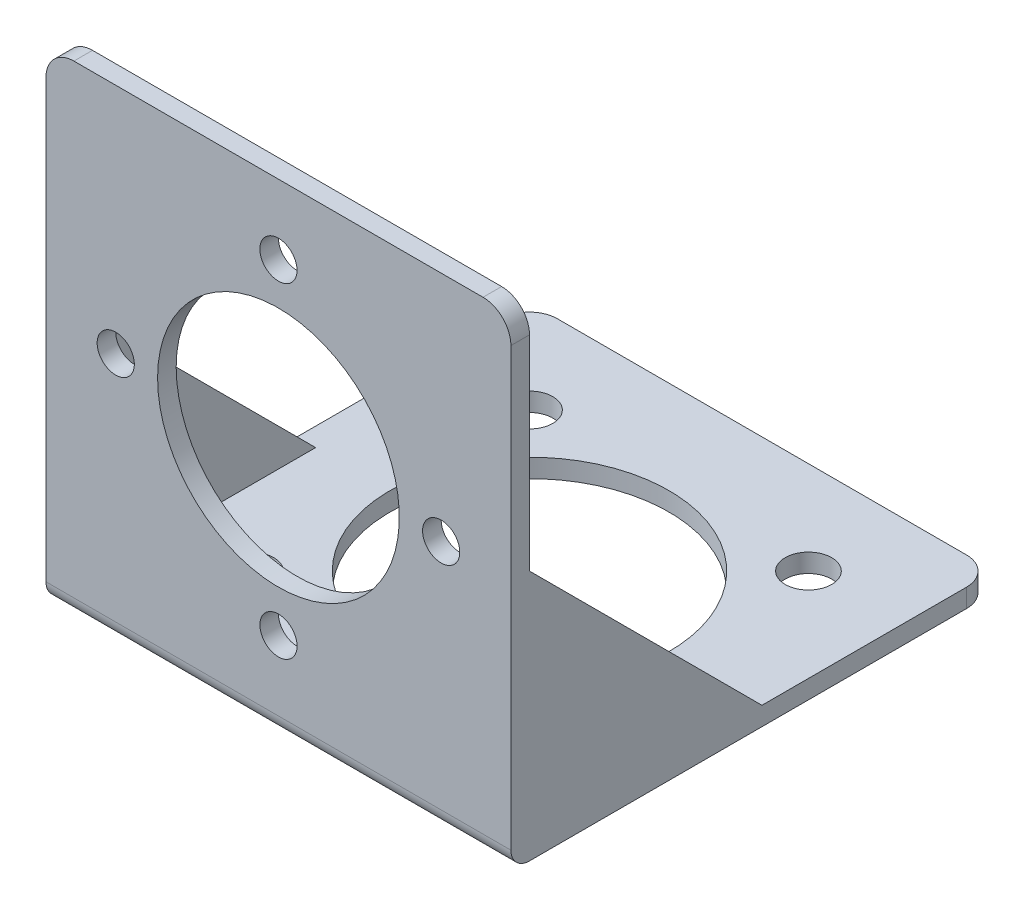
ISO-10303-21;
HEADER;
FILE_DESCRIPTION(('STEP AP214'),'2;1');
FILE_NAME('part.step','',(''),(''),'','','');
FILE_SCHEMA(('AUTOMOTIVE_DESIGN { 1 0 10303 214 1 1 1 1 }'));
ENDSEC;
DATA;
#1=APPLICATION_CONTEXT('core data for automotive mechanical design processes');
#2=APPLICATION_PROTOCOL_DEFINITION('international standard','automotive_design',2000,#1);
#3=PRODUCT_CONTEXT('',#1,'mechanical');
#4=PRODUCT('Part','Part','',(#3));
#5=PRODUCT_RELATED_PRODUCT_CATEGORY('part','',(#4));
#6=PRODUCT_DEFINITION_FORMATION('','',#4);
#7=PRODUCT_DEFINITION_CONTEXT('part definition',#1,'design');
#8=PRODUCT_DEFINITION('design','',#6,#7);
#9=PRODUCT_DEFINITION_SHAPE('','',#8);
#10=(LENGTH_UNIT() NAMED_UNIT(*) SI_UNIT(.MILLI.,.METRE.));
#11=(NAMED_UNIT(*) PLANE_ANGLE_UNIT() SI_UNIT($,.RADIAN.));
#12=(NAMED_UNIT(*) SI_UNIT($,.STERADIAN.) SOLID_ANGLE_UNIT());
#13=UNCERTAINTY_MEASURE_WITH_UNIT(LENGTH_MEASURE(1.E-05),#10,'distance_accuracy_value','');
#14=(GEOMETRIC_REPRESENTATION_CONTEXT(3) GLOBAL_UNCERTAINTY_ASSIGNED_CONTEXT((#13)) GLOBAL_UNIT_ASSIGNED_CONTEXT((#10,
#11,#12)) REPRESENTATION_CONTEXT('',''));
#15=CARTESIAN_POINT('',(0.,0.,0.));
#16=DIRECTION('',(0.,0.,1.));
#17=DIRECTION('',(1.,0.,0.));
#18=AXIS2_PLACEMENT_3D('',#15,#16,#17);
#19=CARTESIAN_POINT('',(96.1386740943104,26.9999999999998,-84.3339885545928));
#20=DIRECTION('',(0.,0.70710678118655,-0.707106781186545));
#21=DIRECTION('',(0.,0.707106781186545,0.70710678118655));
#22=AXIS2_PLACEMENT_3D('',#19,#20,#21);
#23=PLANE('',#22);
#24=DIRECTION('',(-1.,0.,0.));
#25=VECTOR('',#24,1.);
#26=CARTESIAN_POINT('',(96.1386740943104,2.,-109.333988554593));
#27=LINE('',#26,#25);
#28=CARTESIAN_POINT('',(96.1386740943104,2.,-109.333988554593));
#29=VERTEX_POINT('',#28);
#30=CARTESIAN_POINT('',(94.1386740943104,2.,-109.333988554593));
#31=VERTEX_POINT('',#30);
#32=EDGE_CURVE('E186',#29,#31,#27,.T.);
#33=ORIENTED_EDGE('',*,*,#32,.T.);
#34=DIRECTION('',(0.,-0.707106781186548,-0.707106781186547));
#35=VECTOR('',#34,1.);
#36=CARTESIAN_POINT('',(94.1386740943104,27.,-84.3339885545928));
#37=LINE('',#36,#35);
#38=CARTESIAN_POINT('',(94.1386740943104,27.,-84.3339885545928));
#39=VERTEX_POINT('',#38);
#40=EDGE_CURVE('E235',#39,#31,#37,.T.);
#41=ORIENTED_EDGE('',*,*,#40,.F.);
#42=DIRECTION('',(-1.,0.,0.));
#43=VECTOR('',#42,1.);
#44=CARTESIAN_POINT('',(96.1386740943104,26.9999999999998,-84.3339885545928));
#45=LINE('',#44,#43);
#46=CARTESIAN_POINT('',(96.1386740943104,26.9999999999998,-84.3339885545928));
#47=VERTEX_POINT('',#46);
#48=EDGE_CURVE('E171',#47,#39,#45,.T.);
#49=ORIENTED_EDGE('',*,*,#48,.F.);
#50=DIRECTION('',(0.,-0.707106781186545,-0.70710678118655));
#51=VECTOR('',#50,1.);
#52=CARTESIAN_POINT('',(96.1386740943104,26.9999999999998,-84.3339885545928));
#53=LINE('',#52,#51);
#54=EDGE_CURVE('E164',#47,#29,#53,.T.);
#55=ORIENTED_EDGE('',*,*,#54,.T.);
#56=EDGE_LOOP('',(#33,#41,#49,#55));
#57=FACE_BOUND('',#56,.T.);
#58=ADVANCED_FACE('F35',(#57),#23,.T.);
#59=DIRECTION('',(0.,-0.707106781186548,-0.707106781186547));
#60=VECTOR('',#59,1.);
#61=CARTESIAN_POINT('',(48.1386740943102,27.,-84.3339885545928));
#62=LINE('',#61,#60);
#63=CARTESIAN_POINT('',(48.1386740943102,27.,-84.3339885545928));
#64=VERTEX_POINT('',#63);
#65=CARTESIAN_POINT('',(48.1386740943102,2.,-109.333988554593));
#66=VERTEX_POINT('',#65);
#67=EDGE_CURVE('E233',#64,#66,#62,.T.);
#68=ORIENTED_EDGE('',*,*,#67,.T.);
#69=CARTESIAN_POINT('',(46.1386740943102,2.,-109.333988554593));
#70=VERTEX_POINT('',#69);
#71=EDGE_CURVE('E162',#66,#70,#27,.T.);
#72=ORIENTED_EDGE('',*,*,#71,.T.);
#73=DIRECTION('',(0.,-0.707106781186545,-0.70710678118655));
#74=VECTOR('',#73,1.);
#75=CARTESIAN_POINT('',(46.1386740943102,26.9999999999998,-84.3339885545928));
#76=LINE('',#75,#74);
#77=CARTESIAN_POINT('',(46.1386740943102,26.9999999999999,-84.3339885545928));
#78=VERTEX_POINT('',#77);
#79=EDGE_CURVE('E148',#78,#70,#76,.T.);
#80=ORIENTED_EDGE('',*,*,#79,.F.);
#81=EDGE_CURVE('E159',#64,#78,#45,.T.);
#82=ORIENTED_EDGE('',*,*,#81,.F.);
#83=EDGE_LOOP('',(#68,#72,#80,#82));
#84=FACE_BOUND('',#83,.T.);
#85=ADVANCED_FACE('F158',(#84),#23,.T.);
#86=CARTESIAN_POINT('',(96.1386740943104,0.,0.));
#87=DIRECTION('',(1.,0.,0.));
#88=DIRECTION('',(0.,0.,-1.));
#89=AXIS2_PLACEMENT_3D('',#86,#87,#88);
#90=PLANE('',#89);
#91=DIRECTION('',(0.,1.,0.));
#92=VECTOR('',#91,1.);
#93=CARTESIAN_POINT('',(96.1386740943104,52.,-84.3339885545928));
#94=LINE('',#93,#92);
#95=CARTESIAN_POINT('',(96.1386740943104,49.0000000000002,-84.3339885545928));
#96=VERTEX_POINT('',#95);
#97=EDGE_CURVE('E152',#47,#96,#94,.T.);
#98=ORIENTED_EDGE('',*,*,#97,.T.);
#99=DIRECTION('',(0.,0.,-1.));
#100=VECTOR('',#99,1.);
#101=CARTESIAN_POINT('',(96.1386740943104,49.0000000000002,-82.3339885545928));
#102=LINE('',#101,#100);
#103=CARTESIAN_POINT('',(96.1386740943104,49.0000000000002,-82.3339885545928));
#104=VERTEX_POINT('',#103);
#105=EDGE_CURVE('E262',#96,#104,#102,.F.);
#106=ORIENTED_EDGE('',*,*,#105,.T.);
#107=DIRECTION('',(0.,1.,0.));
#108=VECTOR('',#107,1.);
#109=CARTESIAN_POINT('',(96.1386740943104,52.,-82.3339885545928));
#110=LINE('',#109,#108);
#111=CARTESIAN_POINT('',(96.1386740943104,2.00000000000002,-82.3339885545928));
#112=VERTEX_POINT('',#111);
#113=EDGE_CURVE('E319',#112,#104,#110,.T.);
#114=ORIENTED_EDGE('',*,*,#113,.F.);
#115=CARTESIAN_POINT('',(96.1386740943104,2.,-84.3339885545928));
#116=DIRECTION('',(1.,0.,0.));
#117=DIRECTION('',(0.,0.,-1.));
#118=AXIS2_PLACEMENT_3D('',#115,#116,#117);
#119=CIRCLE('',#118,2.);
#120=CARTESIAN_POINT('',(96.1386740943104,0.,-84.3339885545928));
#121=VERTEX_POINT('',#120);
#122=EDGE_CURVE('E197',#112,#121,#119,.T.);
#123=ORIENTED_EDGE('',*,*,#122,.T.);
#124=DIRECTION('',(0.,0.,1.));
#125=VECTOR('',#124,1.);
#126=CARTESIAN_POINT('',(96.1386740943104,0.,-84.3339885545928));
#127=LINE('',#126,#125);
#128=CARTESIAN_POINT('',(96.1386740943104,0.,-131.333988554593));
#129=VERTEX_POINT('',#128);
#130=EDGE_CURVE('E165',#129,#121,#127,.T.);
#131=ORIENTED_EDGE('',*,*,#130,.F.);
#132=DIRECTION('',(0.,1.,0.));
#133=VECTOR('',#132,1.);
#134=CARTESIAN_POINT('',(96.1386740943104,2.,-131.333988554593));
#135=LINE('',#134,#133);
#136=CARTESIAN_POINT('',(96.1386740943104,2.,-131.333988554593));
#137=VERTEX_POINT('',#136);
#138=EDGE_CURVE('E259',#129,#137,#135,.T.);
#139=ORIENTED_EDGE('',*,*,#138,.T.);
#140=DIRECTION('',(0.,0.,1.));
#141=VECTOR('',#140,1.);
#142=CARTESIAN_POINT('',(96.1386740943104,2.,-84.3339885545928));
#143=LINE('',#142,#141);
#144=EDGE_CURVE('E248',#137,#29,#143,.T.);
#145=ORIENTED_EDGE('',*,*,#144,.T.);
#146=ORIENTED_EDGE('',*,*,#54,.F.);
#147=EDGE_LOOP('',(#98,#106,#114,#123,#131,#139,#145,#146));
#148=FACE_BOUND('',#147,.T.);
#149=ADVANCED_FACE('F286',(#148),#90,.T.);
#150=CARTESIAN_POINT('',(46.1386740943102,0.,0.));
#151=DIRECTION('',(1.,0.,0.));
#152=DIRECTION('',(0.,0.,-1.));
#153=AXIS2_PLACEMENT_3D('',#150,#151,#152);
#154=PLANE('',#153);
#155=DIRECTION('',(0.,-1.,0.));
#156=VECTOR('',#155,1.);
#157=CARTESIAN_POINT('',(46.1386740943102,0.,-82.3339885545928));
#158=LINE('',#157,#156);
#159=CARTESIAN_POINT('',(46.1386740943102,49.0000000000001,-82.3339885545928));
#160=VERTEX_POINT('',#159);
#161=CARTESIAN_POINT('',(46.1386740943102,2.,-82.3339885545928));
#162=VERTEX_POINT('',#161);
#163=EDGE_CURVE('E314',#160,#162,#158,.T.);
#164=ORIENTED_EDGE('',*,*,#163,.F.);
#165=DIRECTION('',(0.,0.,-1.));
#166=VECTOR('',#165,1.);
#167=CARTESIAN_POINT('',(46.1386740943102,49.0000000000002,0.));
#168=LINE('',#167,#166);
#169=CARTESIAN_POINT('',(46.1386740943102,49.0000000000001,-84.3339885545928));
#170=VERTEX_POINT('',#169);
#171=EDGE_CURVE('E11',#160,#170,#168,.T.);
#172=ORIENTED_EDGE('',*,*,#171,.T.);
#173=DIRECTION('',(0.,-1.,0.));
#174=VECTOR('',#173,1.);
#175=CARTESIAN_POINT('',(46.1386740943102,0.,-84.3339885545928));
#176=LINE('',#175,#174);
#177=EDGE_CURVE('E144',#170,#78,#176,.T.);
#178=ORIENTED_EDGE('',*,*,#177,.T.);
#179=ORIENTED_EDGE('',*,*,#79,.T.);
#180=DIRECTION('',(0.,0.,-1.));
#181=VECTOR('',#180,1.);
#182=CARTESIAN_POINT('',(46.1386740943102,2.,-134.333988554593));
#183=LINE('',#182,#181);
#184=CARTESIAN_POINT('',(46.1386740943102,2.,-131.333988554593));
#185=VERTEX_POINT('',#184);
#186=EDGE_CURVE('E244',#70,#185,#183,.T.);
#187=ORIENTED_EDGE('',*,*,#186,.T.);
#188=DIRECTION('',(0.,1.,0.));
#189=VECTOR('',#188,1.);
#190=CARTESIAN_POINT('',(46.1386740943102,0.,-131.333988554593));
#191=LINE('',#190,#189);
#192=CARTESIAN_POINT('',(46.1386740943102,0.,-131.333988554593));
#193=VERTEX_POINT('',#192);
#194=EDGE_CURVE('E43',#185,#193,#191,.F.);
#195=ORIENTED_EDGE('',*,*,#194,.T.);
#196=DIRECTION('',(0.,0.,-1.));
#197=VECTOR('',#196,1.);
#198=CARTESIAN_POINT('',(46.1386740943102,0.,-134.333988554593));
#199=LINE('',#198,#197);
#200=CARTESIAN_POINT('',(46.1386740943102,0.,-84.3339885545928));
#201=VERTEX_POINT('',#200);
#202=EDGE_CURVE('E245',#201,#193,#199,.T.);
#203=ORIENTED_EDGE('',*,*,#202,.F.);
#204=CARTESIAN_POINT('',(46.1386740943102,2.,-84.3339885545928));
#205=DIRECTION('',(1.,0.,0.));
#206=DIRECTION('',(0.,0.,-1.));
#207=AXIS2_PLACEMENT_3D('',#204,#205,#206);
#208=CIRCLE('',#207,2.);
#209=EDGE_CURVE('E207',#201,#162,#208,.F.);
#210=ORIENTED_EDGE('',*,*,#209,.T.);
#211=EDGE_LOOP('',(#164,#172,#178,#179,#187,#195,#203,#210));
#212=FACE_BOUND('',#211,.T.);
#213=ADVANCED_FACE('F147',(#212),#154,.F.);
#214=CARTESIAN_POINT('',(0.,2.,0.));
#215=DIRECTION('',(0.,1.,0.));
#216=DIRECTION('',(0.,0.,1.));
#217=AXIS2_PLACEMENT_3D('',#214,#215,#216);
#218=PLANE('',#217);
#219=CARTESIAN_POINT('',(56.1386740943103,2.,-94.3339885545928));
#220=DIRECTION('',(0.,1.,0.));
#221=DIRECTION('',(0.,0.,1.));
#222=AXIS2_PLACEMENT_3D('',#219,#220,#221);
#223=CIRCLE('',#222,2.49999999999993);
#224=CARTESIAN_POINT('',(56.1386740943103,2.,-91.8339885545929));
#225=VERTEX_POINT('',#224);
#226=EDGE_CURVE('E360',#225,#225,#223,.T.);
#227=ORIENTED_EDGE('',*,*,#226,.F.);
#228=EDGE_LOOP('',(#227));
#229=FACE_BOUND('',#228,.T.);
#230=CARTESIAN_POINT('',(86.1386740943104,2.,-94.333988554593));
#231=DIRECTION('',(0.,1.,0.));
#232=DIRECTION('',(0.,0.,1.));
#233=AXIS2_PLACEMENT_3D('',#230,#231,#232);
#234=CIRCLE('',#233,2.49999999999993);
#235=CARTESIAN_POINT('',(86.1386740943104,2.,-91.833988554593));
#236=VERTEX_POINT('',#235);
#237=EDGE_CURVE('E354',#236,#236,#234,.T.);
#238=ORIENTED_EDGE('',*,*,#237,.F.);
#239=EDGE_LOOP('',(#238));
#240=FACE_BOUND('',#239,.T.);
#241=CARTESIAN_POINT('',(86.1386740943102,2.,-124.333988554593));
#242=DIRECTION('',(0.,1.,0.));
#243=DIRECTION('',(0.,0.,1.));
#244=AXIS2_PLACEMENT_3D('',#241,#242,#243);
#245=CIRCLE('',#244,2.49999999999993);
#246=CARTESIAN_POINT('',(86.1386740943102,2.,-121.833988554593));
#247=VERTEX_POINT('',#246);
#248=EDGE_CURVE('E348',#247,#247,#245,.T.);
#249=ORIENTED_EDGE('',*,*,#248,.F.);
#250=EDGE_LOOP('',(#249));
#251=FACE_BOUND('',#250,.T.);
#252=CARTESIAN_POINT('',(56.1386740943102,2.,-124.333988554593));
#253=DIRECTION('',(0.,1.,0.));
#254=DIRECTION('',(0.,0.,1.));
#255=AXIS2_PLACEMENT_3D('',#252,#253,#254);
#256=CIRCLE('',#255,2.49999999999993);
#257=CARTESIAN_POINT('',(56.1386740943102,2.,-121.833988554593));
#258=VERTEX_POINT('',#257);
#259=EDGE_CURVE('E342',#258,#258,#256,.T.);
#260=ORIENTED_EDGE('',*,*,#259,.F.);
#261=EDGE_LOOP('',(#260));
#262=FACE_BOUND('',#261,.T.);
#263=CARTESIAN_POINT('',(71.1386740943103,2.,-109.333988554593));
#264=DIRECTION('',(0.,1.,0.));
#265=DIRECTION('',(0.,0.,1.));
#266=AXIS2_PLACEMENT_3D('',#263,#264,#265);
#267=CIRCLE('',#266,15.0000000000001);
#268=CARTESIAN_POINT('',(71.1386740943103,2.,-94.3339885545927));
#269=VERTEX_POINT('',#268);
#270=EDGE_CURVE('E336',#269,#269,#267,.T.);
#271=ORIENTED_EDGE('',*,*,#270,.F.);
#272=EDGE_LOOP('',(#271));
#273=FACE_BOUND('',#272,.T.);
#274=ORIENTED_EDGE('',*,*,#144,.F.);
#275=CARTESIAN_POINT('',(93.1386740943105,2.,-131.333988554593));
#276=DIRECTION('',(0.,1.,0.));
#277=DIRECTION('',(0.,0.,1.));
#278=AXIS2_PLACEMENT_3D('',#275,#276,#277);
#279=CIRCLE('',#278,2.99999999999989);
#280=CARTESIAN_POINT('',(93.1386740943105,2.,-134.333988554593));
#281=VERTEX_POINT('',#280);
#282=EDGE_CURVE('E270',#137,#281,#279,.T.);
#283=ORIENTED_EDGE('',*,*,#282,.T.);
#284=DIRECTION('',(1.,0.,0.));
#285=VECTOR('',#284,1.);
#286=CARTESIAN_POINT('',(96.1386740943104,2.,-134.333988554593));
#287=LINE('',#286,#285);
#288=CARTESIAN_POINT('',(49.1386740943101,2.,-134.333988554593));
#289=VERTEX_POINT('',#288);
#290=EDGE_CURVE('E253',#289,#281,#287,.T.);
#291=ORIENTED_EDGE('',*,*,#290,.F.);
#292=CARTESIAN_POINT('',(49.1386740943101,2.,-131.333988554593));
#293=DIRECTION('',(0.,1.,0.));
#294=DIRECTION('',(0.,0.,1.));
#295=AXIS2_PLACEMENT_3D('',#292,#293,#294);
#296=CIRCLE('',#295,2.99999999999989);
#297=EDGE_CURVE('E268',#289,#185,#296,.T.);
#298=ORIENTED_EDGE('',*,*,#297,.T.);
#299=ORIENTED_EDGE('',*,*,#186,.F.);
#300=ORIENTED_EDGE('',*,*,#71,.F.);
#301=DIRECTION('',(0.,0.,1.));
#302=VECTOR('',#301,1.);
#303=CARTESIAN_POINT('',(48.1386740943102,2.,-109.333988554593));
#304=LINE('',#303,#302);
#305=CARTESIAN_POINT('',(48.1386740943102,1.99999999999985,-84.3339885545928));
#306=VERTEX_POINT('',#305);
#307=EDGE_CURVE('E238',#66,#306,#304,.T.);
#308=ORIENTED_EDGE('',*,*,#307,.T.);
#309=DIRECTION('',(-1.,0.,0.));
#310=VECTOR('',#309,1.);
#311=CARTESIAN_POINT('',(94.1386740943104,1.99999999999985,-84.3339885545928));
#312=LINE('',#311,#310);
#313=CARTESIAN_POINT('',(94.1386740943104,1.99999999999985,-84.3339885545928));
#314=VERTEX_POINT('',#313);
#315=EDGE_CURVE('E237',#314,#306,#312,.T.);
#316=ORIENTED_EDGE('',*,*,#315,.F.);
#317=DIRECTION('',(0.,0.,1.));
#318=VECTOR('',#317,1.);
#319=CARTESIAN_POINT('',(94.1386740943104,2.,-109.333988554593));
#320=LINE('',#319,#318);
#321=EDGE_CURVE('E229',#31,#314,#320,.T.);
#322=ORIENTED_EDGE('',*,*,#321,.F.);
#323=ORIENTED_EDGE('',*,*,#32,.F.);
#324=EDGE_LOOP('',(#274,#283,#291,#298,#299,#300,#308,#316,#322,#323));
#325=FACE_BOUND('',#324,.T.);
#326=ADVANCED_FACE('F292',(#229,#240,#251,#262,#273,#325),#218,.T.);
#327=CARTESIAN_POINT('',(96.1386740943104,0.,-134.333988554593));
#328=DIRECTION('',(0.,0.,1.));
#329=DIRECTION('',(1.,0.,0.));
#330=AXIS2_PLACEMENT_3D('',#327,#328,#329);
#331=PLANE('',#330);
#332=ORIENTED_EDGE('',*,*,#290,.T.);
#333=DIRECTION('',(0.,1.,0.));
#334=VECTOR('',#333,1.);
#335=CARTESIAN_POINT('',(93.1386740943105,0.,-134.333988554593));
#336=LINE('',#335,#334);
#337=CARTESIAN_POINT('',(93.1386740943105,0.,-134.333988554593));
#338=VERTEX_POINT('',#337);
#339=EDGE_CURVE('E57',#281,#338,#336,.F.);
#340=ORIENTED_EDGE('',*,*,#339,.T.);
#341=DIRECTION('',(1.,0.,0.));
#342=VECTOR('',#341,1.);
#343=CARTESIAN_POINT('',(96.1386740943104,0.,-134.333988554593));
#344=LINE('',#343,#342);
#345=CARTESIAN_POINT('',(49.1386740943101,0.,-134.333988554593));
#346=VERTEX_POINT('',#345);
#347=EDGE_CURVE('E247',#346,#338,#344,.T.);
#348=ORIENTED_EDGE('',*,*,#347,.F.);
#349=DIRECTION('',(0.,1.,0.));
#350=VECTOR('',#349,1.);
#351=CARTESIAN_POINT('',(49.1386740943101,0.,-134.333988554593));
#352=LINE('',#351,#350);
#353=EDGE_CURVE('E272',#346,#289,#352,.T.);
#354=ORIENTED_EDGE('',*,*,#353,.T.);
#355=EDGE_LOOP('',(#332,#340,#348,#354));
#356=FACE_BOUND('',#355,.T.);
#357=ADVANCED_FACE('F293',(#356),#331,.F.);
#358=CARTESIAN_POINT('',(0.,0.,0.));
#359=DIRECTION('',(0.,1.,0.));
#360=DIRECTION('',(0.,0.,1.));
#361=AXIS2_PLACEMENT_3D('',#358,#359,#360);
#362=PLANE('',#361);
#363=CARTESIAN_POINT('',(56.1386740943103,0.,-94.3339885545928));
#364=DIRECTION('',(0.,1.,0.));
#365=DIRECTION('',(0.,0.,1.));
#366=AXIS2_PLACEMENT_3D('',#363,#364,#365);
#367=CIRCLE('',#366,2.49999999999993);
#368=CARTESIAN_POINT('',(56.1386740943103,0.,-91.8339885545929));
#369=VERTEX_POINT('',#368);
#370=EDGE_CURVE('E357',#369,#369,#367,.T.);
#371=ORIENTED_EDGE('',*,*,#370,.T.);
#372=EDGE_LOOP('',(#371));
#373=FACE_BOUND('',#372,.T.);
#374=CARTESIAN_POINT('',(86.1386740943104,0.,-94.333988554593));
#375=DIRECTION('',(0.,1.,0.));
#376=DIRECTION('',(0.,0.,1.));
#377=AXIS2_PLACEMENT_3D('',#374,#375,#376);
#378=CIRCLE('',#377,2.49999999999993);
#379=CARTESIAN_POINT('',(86.1386740943104,0.,-91.833988554593));
#380=VERTEX_POINT('',#379);
#381=EDGE_CURVE('E351',#380,#380,#378,.T.);
#382=ORIENTED_EDGE('',*,*,#381,.T.);
#383=EDGE_LOOP('',(#382));
#384=FACE_BOUND('',#383,.T.);
#385=CARTESIAN_POINT('',(86.1386740943102,0.,-124.333988554593));
#386=DIRECTION('',(0.,1.,0.));
#387=DIRECTION('',(0.,0.,1.));
#388=AXIS2_PLACEMENT_3D('',#385,#386,#387);
#389=CIRCLE('',#388,2.49999999999993);
#390=CARTESIAN_POINT('',(86.1386740943102,0.,-121.833988554593));
#391=VERTEX_POINT('',#390);
#392=EDGE_CURVE('E345',#391,#391,#389,.T.);
#393=ORIENTED_EDGE('',*,*,#392,.T.);
#394=EDGE_LOOP('',(#393));
#395=FACE_BOUND('',#394,.T.);
#396=CARTESIAN_POINT('',(56.1386740943102,0.,-124.333988554593));
#397=DIRECTION('',(0.,1.,0.));
#398=DIRECTION('',(0.,0.,1.));
#399=AXIS2_PLACEMENT_3D('',#396,#397,#398);
#400=CIRCLE('',#399,2.49999999999993);
#401=CARTESIAN_POINT('',(56.1386740943102,0.,-121.833988554593));
#402=VERTEX_POINT('',#401);
#403=EDGE_CURVE('E339',#402,#402,#400,.T.);
#404=ORIENTED_EDGE('',*,*,#403,.T.);
#405=EDGE_LOOP('',(#404));
#406=FACE_BOUND('',#405,.T.);
#407=CARTESIAN_POINT('',(71.1386740943103,0.,-109.333988554593));
#408=DIRECTION('',(0.,1.,0.));
#409=DIRECTION('',(0.,0.,1.));
#410=AXIS2_PLACEMENT_3D('',#407,#408,#409);
#411=CIRCLE('',#410,15.0000000000001);
#412=CARTESIAN_POINT('',(71.1386740943103,0.,-94.3339885545927));
#413=VERTEX_POINT('',#412);
#414=EDGE_CURVE('E333',#413,#413,#411,.T.);
#415=ORIENTED_EDGE('',*,*,#414,.T.);
#416=EDGE_LOOP('',(#415));
#417=FACE_BOUND('',#416,.T.);
#418=ORIENTED_EDGE('',*,*,#347,.T.);
#419=CARTESIAN_POINT('',(93.1386740943105,0.,-131.333988554593));
#420=DIRECTION('',(0.,1.,0.));
#421=DIRECTION('',(0.,0.,1.));
#422=AXIS2_PLACEMENT_3D('',#419,#420,#421);
#423=CIRCLE('',#422,2.99999999999989);
#424=EDGE_CURVE('E278',#338,#129,#423,.F.);
#425=ORIENTED_EDGE('',*,*,#424,.T.);
#426=ORIENTED_EDGE('',*,*,#130,.T.);
#427=DIRECTION('',(1.,0.,0.));
#428=VECTOR('',#427,1.);
#429=CARTESIAN_POINT('',(0.,0.,-84.3339885545928));
#430=LINE('',#429,#428);
#431=EDGE_CURVE('E203',#121,#201,#430,.F.);
#432=ORIENTED_EDGE('',*,*,#431,.T.);
#433=ORIENTED_EDGE('',*,*,#202,.T.);
#434=CARTESIAN_POINT('',(49.1386740943101,0.,-131.333988554593));
#435=DIRECTION('',(0.,1.,0.));
#436=DIRECTION('',(0.,0.,1.));
#437=AXIS2_PLACEMENT_3D('',#434,#435,#436);
#438=CIRCLE('',#437,2.99999999999989);
#439=EDGE_CURVE('E276',#193,#346,#438,.F.);
#440=ORIENTED_EDGE('',*,*,#439,.T.);
#441=EDGE_LOOP('',(#418,#425,#426,#432,#433,#440));
#442=FACE_BOUND('',#441,.T.);
#443=ADVANCED_FACE('F282',(#373,#384,#395,#406,#417,#442),#362,.F.);
#444=CARTESIAN_POINT('',(94.1386740943104,0.,0.));
#445=DIRECTION('',(-1.,0.,0.));
#446=DIRECTION('',(0.,0.,1.));
#447=AXIS2_PLACEMENT_3D('',#444,#445,#446);
#448=PLANE('',#447);
#449=ORIENTED_EDGE('',*,*,#321,.T.);
#450=DIRECTION('',(0.,1.,0.));
#451=VECTOR('',#450,1.);
#452=CARTESIAN_POINT('',(94.1386740943104,1.99999999999985,-84.3339885545928));
#453=LINE('',#452,#451);
#454=EDGE_CURVE('E232',#314,#39,#453,.T.);
#455=ORIENTED_EDGE('',*,*,#454,.T.);
#456=ORIENTED_EDGE('',*,*,#40,.T.);
#457=EDGE_LOOP('',(#449,#455,#456));
#458=FACE_BOUND('',#457,.T.);
#459=ADVANCED_FACE('F302',(#458),#448,.T.);
#460=CARTESIAN_POINT('',(48.1386740943102,0.,0.));
#461=DIRECTION('',(-1.,0.,0.));
#462=DIRECTION('',(0.,0.,1.));
#463=AXIS2_PLACEMENT_3D('',#460,#461,#462);
#464=PLANE('',#463);
#465=ORIENTED_EDGE('',*,*,#307,.F.);
#466=ORIENTED_EDGE('',*,*,#67,.F.);
#467=DIRECTION('',(0.,1.,0.));
#468=VECTOR('',#467,1.);
#469=CARTESIAN_POINT('',(48.1386740943102,1.99999999999985,-84.3339885545928));
#470=LINE('',#469,#468);
#471=EDGE_CURVE('E170',#306,#64,#470,.T.);
#472=ORIENTED_EDGE('',*,*,#471,.F.);
#473=EDGE_LOOP('',(#465,#466,#472));
#474=FACE_BOUND('',#473,.T.);
#475=ADVANCED_FACE('F499',(#474),#464,.F.);
#476=CARTESIAN_POINT('',(46.1386740943102,52.,-82.3339885545928));
#477=DIRECTION('',(0.,-1.,0.));
#478=DIRECTION('',(0.,0.,-1.));
#479=AXIS2_PLACEMENT_3D('',#476,#477,#478);
#480=PLANE('',#479);
#481=DIRECTION('',(-1.,0.,0.));
#482=VECTOR('',#481,1.);
#483=CARTESIAN_POINT('',(46.1386740943102,52.,-82.3339885545928));
#484=LINE('',#483,#482);
#485=CARTESIAN_POINT('',(93.1386740943105,52.,-82.3339885545928));
#486=VERTEX_POINT('',#485);
#487=CARTESIAN_POINT('',(49.1386740943101,52.,-82.3339885545928));
#488=VERTEX_POINT('',#487);
#489=EDGE_CURVE('E221',#486,#488,#484,.T.);
#490=ORIENTED_EDGE('',*,*,#489,.F.);
#491=DIRECTION('',(0.,0.,-1.));
#492=VECTOR('',#491,1.);
#493=CARTESIAN_POINT('',(93.1386740943105,52.,-84.3339885545928));
#494=LINE('',#493,#492);
#495=CARTESIAN_POINT('',(93.1386740943105,52.,-84.3339885545928));
#496=VERTEX_POINT('',#495);
#497=EDGE_CURVE('E212',#486,#496,#494,.T.);
#498=ORIENTED_EDGE('',*,*,#497,.T.);
#499=DIRECTION('',(-1.,0.,0.));
#500=VECTOR('',#499,1.);
#501=CARTESIAN_POINT('',(46.1386740943102,52.,-84.3339885545928));
#502=LINE('',#501,#500);
#503=CARTESIAN_POINT('',(49.1386740943101,52.,-84.3339885545928));
#504=VERTEX_POINT('',#503);
#505=EDGE_CURVE('E225',#496,#504,#502,.T.);
#506=ORIENTED_EDGE('',*,*,#505,.T.);
#507=DIRECTION('',(0.,0.,-1.));
#508=VECTOR('',#507,1.);
#509=CARTESIAN_POINT('',(49.1386740943101,52.,-82.3339885545928));
#510=LINE('',#509,#508);
#511=EDGE_CURVE('E210',#504,#488,#510,.F.);
#512=ORIENTED_EDGE('',*,*,#511,.T.);
#513=EDGE_LOOP('',(#490,#498,#506,#512));
#514=FACE_BOUND('',#513,.T.);
#515=ADVANCED_FACE('F312',(#514),#480,.F.);
#516=CARTESIAN_POINT('',(0.,0.,-82.3339885545928));
#517=DIRECTION('',(0.,0.,-1.));
#518=DIRECTION('',(-1.,0.,0.));
#519=AXIS2_PLACEMENT_3D('',#516,#517,#518);
#520=PLANE('',#519);
#521=CARTESIAN_POINT('',(53.6386740943103,27.0000000000002,-82.3339885545928));
#522=DIRECTION('',(0.,0.,-1.));
#523=DIRECTION('',(-1.,0.,0.));
#524=AXIS2_PLACEMENT_3D('',#521,#522,#523);
#525=CIRCLE('',#524,1.99999999999998);
#526=CARTESIAN_POINT('',(51.6386740943103,27.0000000000002,-82.3339885545928));
#527=VERTEX_POINT('',#526);
#528=EDGE_CURVE('E375',#527,#527,#525,.T.);
#529=ORIENTED_EDGE('',*,*,#528,.T.);
#530=EDGE_LOOP('',(#529));
#531=FACE_BOUND('',#530,.T.);
#532=CARTESIAN_POINT('',(71.1386740943103,9.50000000000004,-82.3339885545928));
#533=DIRECTION('',(0.,0.,-1.));
#534=DIRECTION('',(-1.,0.,0.));
#535=AXIS2_PLACEMENT_3D('',#532,#533,#534);
#536=CIRCLE('',#535,1.99999999999999);
#537=CARTESIAN_POINT('',(69.1386740943103,9.50000000000004,-82.3339885545928));
#538=VERTEX_POINT('',#537);
#539=EDGE_CURVE('E369',#538,#538,#536,.T.);
#540=ORIENTED_EDGE('',*,*,#539,.T.);
#541=EDGE_LOOP('',(#540));
#542=FACE_BOUND('',#541,.T.);
#543=CARTESIAN_POINT('',(88.6386740943103,27.,-82.3339885545928));
#544=DIRECTION('',(0.,0.,-1.));
#545=DIRECTION('',(-1.,0.,0.));
#546=AXIS2_PLACEMENT_3D('',#543,#544,#545);
#547=CIRCLE('',#546,1.99999999999999);
#548=CARTESIAN_POINT('',(86.6386740943103,27.,-82.3339885545928));
#549=VERTEX_POINT('',#548);
#550=EDGE_CURVE('E363',#549,#549,#547,.T.);
#551=ORIENTED_EDGE('',*,*,#550,.T.);
#552=EDGE_LOOP('',(#551));
#553=FACE_BOUND('',#552,.T.);
#554=CARTESIAN_POINT('',(71.1386740943103,44.5,-82.3339885545928));
#555=DIRECTION('',(0.,0.,-1.));
#556=DIRECTION('',(-1.,0.,0.));
#557=AXIS2_PLACEMENT_3D('',#554,#555,#556);
#558=CIRCLE('',#557,1.99999999999999);
#559=CARTESIAN_POINT('',(69.1386740943103,44.5,-82.3339885545928));
#560=VERTEX_POINT('',#559);
#561=EDGE_CURVE('E327',#560,#560,#558,.T.);
#562=ORIENTED_EDGE('',*,*,#561,.T.);
#563=EDGE_LOOP('',(#562));
#564=FACE_BOUND('',#563,.T.);
#565=CARTESIAN_POINT('',(71.1386740943103,27.,-82.3339885545928));
#566=DIRECTION('',(0.,0.,-1.));
#567=DIRECTION('',(-1.,0.,0.));
#568=AXIS2_PLACEMENT_3D('',#565,#566,#567);
#569=CIRCLE('',#568,13.);
#570=CARTESIAN_POINT('',(58.1386740943103,27.,-82.3339885545928));
#571=VERTEX_POINT('',#570);
#572=EDGE_CURVE('E153',#571,#571,#569,.T.);
#573=ORIENTED_EDGE('',*,*,#572,.T.);
#574=EDGE_LOOP('',(#573));
#575=FACE_BOUND('',#574,.T.);
#576=ORIENTED_EDGE('',*,*,#113,.T.);
#577=CARTESIAN_POINT('',(93.1386740943105,49.0000000000002,-82.3339885545928));
#578=DIRECTION('',(0.,0.,-1.));
#579=DIRECTION('',(-1.,0.,0.));
#580=AXIS2_PLACEMENT_3D('',#577,#578,#579);
#581=CIRCLE('',#580,2.99999999999989);
#582=EDGE_CURVE('E266',#104,#486,#581,.F.);
#583=ORIENTED_EDGE('',*,*,#582,.T.);
#584=ORIENTED_EDGE('',*,*,#489,.T.);
#585=CARTESIAN_POINT('',(49.1386740943101,49.0000000000002,-82.3339885545928));
#586=DIRECTION('',(0.,0.,-1.));
#587=DIRECTION('',(-1.,0.,0.));
#588=AXIS2_PLACEMENT_3D('',#585,#586,#587);
#589=CIRCLE('',#588,2.99999999999989);
#590=EDGE_CURVE('E264',#488,#160,#589,.F.);
#591=ORIENTED_EDGE('',*,*,#590,.T.);
#592=ORIENTED_EDGE('',*,*,#163,.T.);
#593=DIRECTION('',(1.,0.,0.));
#594=VECTOR('',#593,1.);
#595=CARTESIAN_POINT('',(0.,2.,-82.3339885545928));
#596=LINE('',#595,#594);
#597=EDGE_CURVE('E189',#162,#112,#596,.T.);
#598=ORIENTED_EDGE('',*,*,#597,.T.);
#599=EDGE_LOOP('',(#576,#583,#584,#591,#592,#598));
#600=FACE_BOUND('',#599,.T.);
#601=ADVANCED_FACE('F317',(#531,#542,#553,#564,#575,#600),#520,.F.);
#602=CARTESIAN_POINT('',(0.,0.,-84.3339885545928));
#603=DIRECTION('',(0.,0.,-1.));
#604=DIRECTION('',(-1.,0.,0.));
#605=AXIS2_PLACEMENT_3D('',#602,#603,#604);
#606=PLANE('',#605);
#607=CARTESIAN_POINT('',(53.6386740943103,27.0000000000002,-84.3339885545928));
#608=DIRECTION('',(0.,0.,-1.));
#609=DIRECTION('',(-1.,0.,0.));
#610=AXIS2_PLACEMENT_3D('',#607,#608,#609);
#611=CIRCLE('',#610,1.99999999999998);
#612=CARTESIAN_POINT('',(51.6386740943103,27.0000000000002,-84.3339885545928));
#613=VERTEX_POINT('',#612);
#614=EDGE_CURVE('E378',#613,#613,#611,.T.);
#615=ORIENTED_EDGE('',*,*,#614,.F.);
#616=EDGE_LOOP('',(#615));
#617=FACE_BOUND('',#616,.T.);
#618=CARTESIAN_POINT('',(71.1386740943103,9.50000000000004,-84.3339885545928));
#619=DIRECTION('',(0.,0.,-1.));
#620=DIRECTION('',(-1.,0.,0.));
#621=AXIS2_PLACEMENT_3D('',#618,#619,#620);
#622=CIRCLE('',#621,1.99999999999999);
#623=CARTESIAN_POINT('',(69.1386740943103,9.50000000000004,-84.3339885545928));
#624=VERTEX_POINT('',#623);
#625=EDGE_CURVE('E372',#624,#624,#622,.T.);
#626=ORIENTED_EDGE('',*,*,#625,.F.);
#627=EDGE_LOOP('',(#626));
#628=FACE_BOUND('',#627,.T.);
#629=CARTESIAN_POINT('',(88.6386740943103,27.,-84.3339885545928));
#630=DIRECTION('',(0.,0.,-1.));
#631=DIRECTION('',(-1.,0.,0.));
#632=AXIS2_PLACEMENT_3D('',#629,#630,#631);
#633=CIRCLE('',#632,1.99999999999999);
#634=CARTESIAN_POINT('',(86.6386740943103,27.,-84.3339885545928));
#635=VERTEX_POINT('',#634);
#636=EDGE_CURVE('E366',#635,#635,#633,.T.);
#637=ORIENTED_EDGE('',*,*,#636,.F.);
#638=EDGE_LOOP('',(#637));
#639=FACE_BOUND('',#638,.T.);
#640=CARTESIAN_POINT('',(71.1386740943103,44.5,-84.3339885545928));
#641=DIRECTION('',(0.,0.,-1.));
#642=DIRECTION('',(-1.,0.,0.));
#643=AXIS2_PLACEMENT_3D('',#640,#641,#642);
#644=CIRCLE('',#643,1.99999999999999);
#645=CARTESIAN_POINT('',(69.1386740943103,44.5,-84.3339885545928));
#646=VERTEX_POINT('',#645);
#647=EDGE_CURVE('E330',#646,#646,#644,.T.);
#648=ORIENTED_EDGE('',*,*,#647,.F.);
#649=EDGE_LOOP('',(#648));
#650=FACE_BOUND('',#649,.T.);
#651=CARTESIAN_POINT('',(71.1386740943103,27.,-84.3339885545928));
#652=DIRECTION('',(0.,0.,-1.));
#653=DIRECTION('',(-1.,0.,0.));
#654=AXIS2_PLACEMENT_3D('',#651,#652,#653);
#655=CIRCLE('',#654,13.);
#656=CARTESIAN_POINT('',(58.1386740943103,27.,-84.3339885545928));
#657=VERTEX_POINT('',#656);
#658=EDGE_CURVE('E324',#657,#657,#655,.T.);
#659=ORIENTED_EDGE('',*,*,#658,.F.);
#660=EDGE_LOOP('',(#659));
#661=FACE_BOUND('',#660,.T.);
#662=ORIENTED_EDGE('',*,*,#505,.F.);
#663=CARTESIAN_POINT('',(93.1386740943105,49.0000000000002,-84.3339885545928));
#664=DIRECTION('',(0.,0.,-1.));
#665=DIRECTION('',(-1.,0.,0.));
#666=AXIS2_PLACEMENT_3D('',#663,#664,#665);
#667=CIRCLE('',#666,2.99999999999989);
#668=EDGE_CURVE('E258',#496,#96,#667,.T.);
#669=ORIENTED_EDGE('',*,*,#668,.T.);
#670=ORIENTED_EDGE('',*,*,#97,.F.);
#671=ORIENTED_EDGE('',*,*,#48,.T.);
#672=ORIENTED_EDGE('',*,*,#454,.F.);
#673=ORIENTED_EDGE('',*,*,#315,.T.);
#674=ORIENTED_EDGE('',*,*,#471,.T.);
#675=ORIENTED_EDGE('',*,*,#81,.T.);
#676=ORIENTED_EDGE('',*,*,#177,.F.);
#677=CARTESIAN_POINT('',(49.1386740943101,49.0000000000002,-84.3339885545928));
#678=DIRECTION('',(0.,0.,-1.));
#679=DIRECTION('',(-1.,0.,0.));
#680=AXIS2_PLACEMENT_3D('',#677,#678,#679);
#681=CIRCLE('',#680,2.99999999999989);
#682=EDGE_CURVE('E214',#170,#504,#681,.T.);
#683=ORIENTED_EDGE('',*,*,#682,.T.);
#684=EDGE_LOOP('',(#662,#669,#670,#671,#672,#673,#674,#675,#676,#683));
#685=FACE_BOUND('',#684,.T.);
#686=ADVANCED_FACE('F168',(#617,#628,#639,#650,#661,#685),#606,.T.);
#687=CARTESIAN_POINT('',(71.1386740943103,27.,-84.3339885545928));
#688=DIRECTION('',(0.,0.,-1.));
#689=DIRECTION('',(-1.,0.,0.));
#690=AXIS2_PLACEMENT_3D('',#687,#688,#689);
#691=CYLINDRICAL_SURFACE('',#690,13.);
#692=ORIENTED_EDGE('',*,*,#572,.F.);
#693=EDGE_LOOP('',(#692));
#694=FACE_BOUND('',#693,.T.);
#695=ORIENTED_EDGE('',*,*,#658,.T.);
#696=EDGE_LOOP('',(#695));
#697=FACE_BOUND('',#696,.T.);
#698=ADVANCED_FACE('F386',(#694,#697),#691,.F.);
#699=CARTESIAN_POINT('',(71.1386740943103,44.5,-84.3339885545928));
#700=DIRECTION('',(0.,0.,-1.));
#701=DIRECTION('',(-1.,0.,0.));
#702=AXIS2_PLACEMENT_3D('',#699,#700,#701);
#703=CYLINDRICAL_SURFACE('',#702,1.99999999999999);
#704=ORIENTED_EDGE('',*,*,#561,.F.);
#705=EDGE_LOOP('',(#704));
#706=FACE_BOUND('',#705,.T.);
#707=ORIENTED_EDGE('',*,*,#647,.T.);
#708=EDGE_LOOP('',(#707));
#709=FACE_BOUND('',#708,.T.);
#710=ADVANCED_FACE('F397',(#706,#709),#703,.F.);
#711=CARTESIAN_POINT('',(71.1386740943103,2.,-109.333988554593));
#712=DIRECTION('',(0.,1.,0.));
#713=DIRECTION('',(0.,0.,1.));
#714=AXIS2_PLACEMENT_3D('',#711,#712,#713);
#715=CYLINDRICAL_SURFACE('',#714,15.0000000000001);
#716=ORIENTED_EDGE('',*,*,#414,.F.);
#717=EDGE_LOOP('',(#716));
#718=FACE_BOUND('',#717,.T.);
#719=ORIENTED_EDGE('',*,*,#270,.T.);
#720=EDGE_LOOP('',(#719));
#721=FACE_BOUND('',#720,.T.);
#722=ADVANCED_FACE('F403',(#718,#721),#715,.F.);
#723=CARTESIAN_POINT('',(56.1386740943102,2.,-124.333988554593));
#724=DIRECTION('',(0.,1.,0.));
#725=DIRECTION('',(0.,0.,1.));
#726=AXIS2_PLACEMENT_3D('',#723,#724,#725);
#727=CYLINDRICAL_SURFACE('',#726,2.49999999999993);
#728=ORIENTED_EDGE('',*,*,#403,.F.);
#729=EDGE_LOOP('',(#728));
#730=FACE_BOUND('',#729,.T.);
#731=ORIENTED_EDGE('',*,*,#259,.T.);
#732=EDGE_LOOP('',(#731));
#733=FACE_BOUND('',#732,.T.);
#734=ADVANCED_FACE('F420',(#730,#733),#727,.F.);
#735=CARTESIAN_POINT('',(0.,2.,-84.3339885545928));
#736=DIRECTION('',(1.,0.,0.));
#737=DIRECTION('',(0.,0.,-1.));
#738=AXIS2_PLACEMENT_3D('',#735,#736,#737);
#739=CYLINDRICAL_SURFACE('',#738,2.);
#740=ORIENTED_EDGE('',*,*,#209,.F.);
#741=ORIENTED_EDGE('',*,*,#431,.F.);
#742=ORIENTED_EDGE('',*,*,#122,.F.);
#743=ORIENTED_EDGE('',*,*,#597,.F.);
#744=EDGE_LOOP('',(#740,#741,#742,#743));
#745=FACE_BOUND('',#744,.T.);
#746=ADVANCED_FACE('F416',(#745),#739,.T.);
#747=CARTESIAN_POINT('',(93.1386740943105,49.0000000000002,-82.3339885545928));
#748=DIRECTION('',(0.,0.,1.));
#749=DIRECTION('',(1.,0.,0.));
#750=AXIS2_PLACEMENT_3D('',#747,#748,#749);
#751=CYLINDRICAL_SURFACE('',#750,2.99999999999989);
#752=ORIENTED_EDGE('',*,*,#582,.F.);
#753=ORIENTED_EDGE('',*,*,#105,.F.);
#754=ORIENTED_EDGE('',*,*,#668,.F.);
#755=ORIENTED_EDGE('',*,*,#497,.F.);
#756=EDGE_LOOP('',(#752,#753,#754,#755));
#757=FACE_BOUND('',#756,.T.);
#758=ADVANCED_FACE('F419',(#757),#751,.T.);
#759=CARTESIAN_POINT('',(93.1386740943105,0.,-131.333988554593));
#760=DIRECTION('',(0.,-1.,0.));
#761=DIRECTION('',(0.,0.,-1.));
#762=AXIS2_PLACEMENT_3D('',#759,#760,#761);
#763=CYLINDRICAL_SURFACE('',#762,2.99999999999989);
#764=ORIENTED_EDGE('',*,*,#424,.F.);
#765=ORIENTED_EDGE('',*,*,#339,.F.);
#766=ORIENTED_EDGE('',*,*,#282,.F.);
#767=ORIENTED_EDGE('',*,*,#138,.F.);
#768=EDGE_LOOP('',(#764,#765,#766,#767));
#769=FACE_BOUND('',#768,.T.);
#770=ADVANCED_FACE('F289',(#769),#763,.T.);
#771=CARTESIAN_POINT('',(49.1386740943101,49.0000000000002,0.));
#772=DIRECTION('',(0.,0.,-1.));
#773=DIRECTION('',(-1.,0.,0.));
#774=AXIS2_PLACEMENT_3D('',#771,#772,#773);
#775=CYLINDRICAL_SURFACE('',#774,2.99999999999989);
#776=ORIENTED_EDGE('',*,*,#590,.F.);
#777=ORIENTED_EDGE('',*,*,#511,.F.);
#778=ORIENTED_EDGE('',*,*,#682,.F.);
#779=ORIENTED_EDGE('',*,*,#171,.F.);
#780=EDGE_LOOP('',(#776,#777,#778,#779));
#781=FACE_BOUND('',#780,.T.);
#782=ADVANCED_FACE('F316',(#781),#775,.T.);
#783=CARTESIAN_POINT('',(49.1386740943101,0.,-131.333988554593));
#784=DIRECTION('',(0.,1.,0.));
#785=DIRECTION('',(0.,0.,1.));
#786=AXIS2_PLACEMENT_3D('',#783,#784,#785);
#787=CYLINDRICAL_SURFACE('',#786,2.99999999999989);
#788=ORIENTED_EDGE('',*,*,#439,.F.);
#789=ORIENTED_EDGE('',*,*,#194,.F.);
#790=ORIENTED_EDGE('',*,*,#297,.F.);
#791=ORIENTED_EDGE('',*,*,#353,.F.);
#792=EDGE_LOOP('',(#788,#789,#790,#791));
#793=FACE_BOUND('',#792,.T.);
#794=ADVANCED_FACE('F37',(#793),#787,.T.);
#795=CARTESIAN_POINT('',(86.1386740943102,2.,-124.333988554593));
#796=DIRECTION('',(0.,1.,0.));
#797=DIRECTION('',(0.,0.,1.));
#798=AXIS2_PLACEMENT_3D('',#795,#796,#797);
#799=CYLINDRICAL_SURFACE('',#798,2.49999999999993);
#800=ORIENTED_EDGE('',*,*,#392,.F.);
#801=EDGE_LOOP('',(#800));
#802=FACE_BOUND('',#801,.T.);
#803=ORIENTED_EDGE('',*,*,#248,.T.);
#804=EDGE_LOOP('',(#803));
#805=FACE_BOUND('',#804,.T.);
#806=ADVANCED_FACE('F429',(#802,#805),#799,.F.);
#807=CARTESIAN_POINT('',(86.1386740943104,2.,-94.333988554593));
#808=DIRECTION('',(0.,1.,0.));
#809=DIRECTION('',(0.,0.,1.));
#810=AXIS2_PLACEMENT_3D('',#807,#808,#809);
#811=CYLINDRICAL_SURFACE('',#810,2.49999999999993);
#812=ORIENTED_EDGE('',*,*,#381,.F.);
#813=EDGE_LOOP('',(#812));
#814=FACE_BOUND('',#813,.T.);
#815=ORIENTED_EDGE('',*,*,#237,.T.);
#816=EDGE_LOOP('',(#815));
#817=FACE_BOUND('',#816,.T.);
#818=ADVANCED_FACE('F433',(#814,#817),#811,.F.);
#819=CARTESIAN_POINT('',(56.1386740943103,2.,-94.3339885545928));
#820=DIRECTION('',(0.,1.,0.));
#821=DIRECTION('',(0.,0.,1.));
#822=AXIS2_PLACEMENT_3D('',#819,#820,#821);
#823=CYLINDRICAL_SURFACE('',#822,2.49999999999993);
#824=ORIENTED_EDGE('',*,*,#370,.F.);
#825=EDGE_LOOP('',(#824));
#826=FACE_BOUND('',#825,.T.);
#827=ORIENTED_EDGE('',*,*,#226,.T.);
#828=EDGE_LOOP('',(#827));
#829=FACE_BOUND('',#828,.T.);
#830=ADVANCED_FACE('F439',(#826,#829),#823,.F.);
#831=CARTESIAN_POINT('',(88.6386740943103,27.,-84.3339885545928));
#832=DIRECTION('',(0.,0.,-1.));
#833=DIRECTION('',(-1.,0.,0.));
#834=AXIS2_PLACEMENT_3D('',#831,#832,#833);
#835=CYLINDRICAL_SURFACE('',#834,1.99999999999999);
#836=ORIENTED_EDGE('',*,*,#550,.F.);
#837=EDGE_LOOP('',(#836));
#838=FACE_BOUND('',#837,.T.);
#839=ORIENTED_EDGE('',*,*,#636,.T.);
#840=EDGE_LOOP('',(#839));
#841=FACE_BOUND('',#840,.T.);
#842=ADVANCED_FACE('F555',(#838,#841),#835,.F.);
#843=CARTESIAN_POINT('',(71.1386740943103,9.50000000000004,-84.3339885545928));
#844=DIRECTION('',(0.,0.,-1.));
#845=DIRECTION('',(-1.,0.,0.));
#846=AXIS2_PLACEMENT_3D('',#843,#844,#845);
#847=CYLINDRICAL_SURFACE('',#846,1.99999999999999);
#848=ORIENTED_EDGE('',*,*,#539,.F.);
#849=EDGE_LOOP('',(#848));
#850=FACE_BOUND('',#849,.T.);
#851=ORIENTED_EDGE('',*,*,#625,.T.);
#852=EDGE_LOOP('',(#851));
#853=FACE_BOUND('',#852,.T.);
#854=ADVANCED_FACE('F577',(#850,#853),#847,.F.);
#855=CARTESIAN_POINT('',(53.6386740943103,27.0000000000002,-84.3339885545928));
#856=DIRECTION('',(0.,0.,-1.));
#857=DIRECTION('',(-1.,0.,0.));
#858=AXIS2_PLACEMENT_3D('',#855,#856,#857);
#859=CYLINDRICAL_SURFACE('',#858,1.99999999999998);
#860=ORIENTED_EDGE('',*,*,#528,.F.);
#861=EDGE_LOOP('',(#860));
#862=FACE_BOUND('',#861,.T.);
#863=ORIENTED_EDGE('',*,*,#614,.T.);
#864=EDGE_LOOP('',(#863));
#865=FACE_BOUND('',#864,.T.);
#866=ADVANCED_FACE('F382',(#862,#865),#859,.F.);
#867=CLOSED_SHELL('',(#58,#85,#149,#213,#326,#357,#443,#459,#475,#515,#601,#686,#698,#710,#722,
#734,#746,#758,#770,#782,#794,#806,#818,#830,#842,#854,#866));
#868=MANIFOLD_SOLID_BREP('B2',#867);
#869=ADVANCED_BREP_SHAPE_REPRESENTATION('',(#18,#868),#14);
#870=SHAPE_DEFINITION_REPRESENTATION(#9,#869);
ENDSEC;
END-ISO-10303-21;
